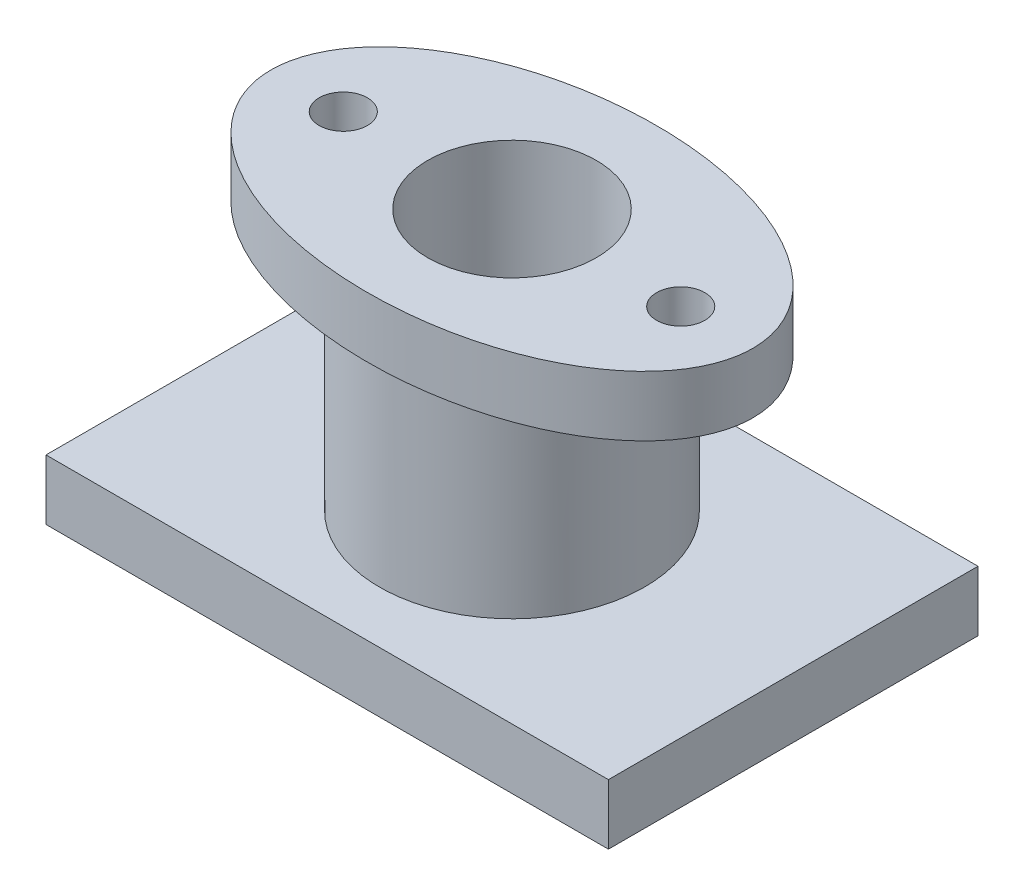
ISO-10303-21;
HEADER;
FILE_DESCRIPTION(('STEP AP214'),'2;1');
FILE_NAME('part.step','',(''),(''),'','','');
FILE_SCHEMA(('AUTOMOTIVE_DESIGN { 1 0 10303 214 1 1 1 1 }'));
ENDSEC;
DATA;
#1=APPLICATION_CONTEXT('core data for automotive mechanical design processes');
#2=APPLICATION_PROTOCOL_DEFINITION('international standard','automotive_design',2000,#1);
#3=PRODUCT_CONTEXT('',#1,'mechanical');
#4=PRODUCT('Part','Part','',(#3));
#5=PRODUCT_RELATED_PRODUCT_CATEGORY('part','',(#4));
#6=PRODUCT_DEFINITION_FORMATION('','',#4);
#7=PRODUCT_DEFINITION_CONTEXT('part definition',#1,'design');
#8=PRODUCT_DEFINITION('design','',#6,#7);
#9=PRODUCT_DEFINITION_SHAPE('','',#8);
#10=(LENGTH_UNIT() NAMED_UNIT(*) SI_UNIT(.MILLI.,.METRE.));
#11=(NAMED_UNIT(*) PLANE_ANGLE_UNIT() SI_UNIT($,.RADIAN.));
#12=(NAMED_UNIT(*) SI_UNIT($,.STERADIAN.) SOLID_ANGLE_UNIT());
#13=UNCERTAINTY_MEASURE_WITH_UNIT(LENGTH_MEASURE(1.E-05),#10,'distance_accuracy_value','');
#14=(GEOMETRIC_REPRESENTATION_CONTEXT(3) GLOBAL_UNCERTAINTY_ASSIGNED_CONTEXT((#13)) GLOBAL_UNIT_ASSIGNED_CONTEXT((#10,
#11,#12)) REPRESENTATION_CONTEXT('',''));
#15=CARTESIAN_POINT('',(0.,0.,0.));
#16=DIRECTION('',(0.,0.,1.));
#17=DIRECTION('',(1.,0.,0.));
#18=AXIS2_PLACEMENT_3D('',#15,#16,#17);
#19=CARTESIAN_POINT('',(0.,15.,0.));
#20=DIRECTION('',(0.,-1.,0.));
#21=DIRECTION('',(0.,0.,-1.));
#22=AXIS2_PLACEMENT_3D('',#19,#20,#21);
#23=PLANE('',#22);
#24=CARTESIAN_POINT('',(0.,15.,0.));
#25=DIRECTION('',(0.,1.,0.));
#26=DIRECTION('',(0.,0.,1.));
#27=AXIS2_PLACEMENT_3D('',#24,#25,#26);
#28=CIRCLE('',#27,16.5);
#29=CARTESIAN_POINT('',(0.,15.,16.5));
#30=VERTEX_POINT('',#29);
#31=EDGE_CURVE('E103',#30,#30,#28,.T.);
#32=ORIENTED_EDGE('',*,*,#31,.F.);
#33=EDGE_LOOP('',(#32));
#34=FACE_BOUND('',#33,.T.);
#35=CARTESIAN_POINT('',(0.,15.,0.));
#36=DIRECTION('',(0.,1.,0.));
#37=DIRECTION('',(0.,0.,1.));
#38=AXIS2_PLACEMENT_3D('',#35,#36,#37);
#39=CIRCLE('',#38,21.);
#40=CARTESIAN_POINT('',(0.,15.,21.));
#41=VERTEX_POINT('',#40);
#42=EDGE_CURVE('E124',#41,#41,#39,.T.);
#43=ORIENTED_EDGE('',*,*,#42,.T.);
#44=EDGE_LOOP('',(#43));
#45=FACE_BOUND('',#44,.T.);
#46=ADVANCED_FACE('F33',(#34,#45),#23,.F.);
#47=CARTESIAN_POINT('',(0.,15.,0.));
#48=DIRECTION('',(0.,-1.,0.));
#49=DIRECTION('',(0.,0.,-1.));
#50=AXIS2_PLACEMENT_3D('',#47,#48,#49);
#51=CIRCLE('',#50,33.);
#52=CARTESIAN_POINT('',(0.,15.,-33.));
#53=VERTEX_POINT('',#52);
#54=EDGE_CURVE('E11',#53,#53,#51,.F.);
#55=ORIENTED_EDGE('',*,*,#54,.F.);
#56=EDGE_LOOP('',(#55));
#57=FACE_BOUND('',#56,.T.);
#58=DIRECTION('',(0.,0.,-1.));
#59=VECTOR('',#58,1.);
#60=CARTESIAN_POINT('',(70.,15.,46.));
#61=LINE('',#60,#59);
#62=CARTESIAN_POINT('',(70.,15.,46.));
#63=VERTEX_POINT('',#62);
#64=CARTESIAN_POINT('',(70.,15.,-46.));
#65=VERTEX_POINT('',#64);
#66=EDGE_CURVE('E86',#63,#65,#61,.T.);
#67=ORIENTED_EDGE('',*,*,#66,.T.);
#68=DIRECTION('',(-1.,0.,0.));
#69=VECTOR('',#68,1.);
#70=CARTESIAN_POINT('',(-70.,15.,-46.));
#71=LINE('',#70,#69);
#72=CARTESIAN_POINT('',(-70.,15.,-46.));
#73=VERTEX_POINT('',#72);
#74=EDGE_CURVE('E81',#65,#73,#71,.T.);
#75=ORIENTED_EDGE('',*,*,#74,.T.);
#76=DIRECTION('',(0.,0.,1.));
#77=VECTOR('',#76,1.);
#78=CARTESIAN_POINT('',(-70.,15.,46.));
#79=LINE('',#78,#77);
#80=CARTESIAN_POINT('',(-70.,15.,46.));
#81=VERTEX_POINT('',#80);
#82=EDGE_CURVE('E84',#73,#81,#79,.T.);
#83=ORIENTED_EDGE('',*,*,#82,.T.);
#84=DIRECTION('',(1.,0.,0.));
#85=VECTOR('',#84,1.);
#86=CARTESIAN_POINT('',(-70.,15.,46.));
#87=LINE('',#86,#85);
#88=EDGE_CURVE('E50',#81,#63,#87,.T.);
#89=ORIENTED_EDGE('',*,*,#88,.T.);
#90=EDGE_LOOP('',(#67,#75,#83,#89));
#91=FACE_BOUND('',#90,.T.);
#92=ADVANCED_FACE('F82',(#57,#91),#23,.F.);
#93=CARTESIAN_POINT('',(0.,0.,0.));
#94=DIRECTION('',(0.,-1.,0.));
#95=DIRECTION('',(0.,0.,-1.));
#96=AXIS2_PLACEMENT_3D('',#93,#94,#95);
#97=PLANE('',#96);
#98=DIRECTION('',(0.,0.,-1.));
#99=VECTOR('',#98,1.);
#100=CARTESIAN_POINT('',(70.,0.,46.));
#101=LINE('',#100,#99);
#102=CARTESIAN_POINT('',(70.,0.,46.));
#103=VERTEX_POINT('',#102);
#104=CARTESIAN_POINT('',(70.,0.,-46.));
#105=VERTEX_POINT('',#104);
#106=EDGE_CURVE('E100',#103,#105,#101,.T.);
#107=ORIENTED_EDGE('',*,*,#106,.F.);
#108=DIRECTION('',(1.,0.,0.));
#109=VECTOR('',#108,1.);
#110=CARTESIAN_POINT('',(-70.,0.,46.));
#111=LINE('',#110,#109);
#112=CARTESIAN_POINT('',(-70.,0.,46.));
#113=VERTEX_POINT('',#112);
#114=EDGE_CURVE('E73',#113,#103,#111,.T.);
#115=ORIENTED_EDGE('',*,*,#114,.F.);
#116=DIRECTION('',(0.,0.,1.));
#117=VECTOR('',#116,1.);
#118=CARTESIAN_POINT('',(-70.,0.,46.));
#119=LINE('',#118,#117);
#120=CARTESIAN_POINT('',(-70.,0.,-46.));
#121=VERTEX_POINT('',#120);
#122=EDGE_CURVE('E67',#121,#113,#119,.T.);
#123=ORIENTED_EDGE('',*,*,#122,.F.);
#124=DIRECTION('',(-1.,0.,0.));
#125=VECTOR('',#124,1.);
#126=CARTESIAN_POINT('',(-70.,0.,-46.));
#127=LINE('',#126,#125);
#128=EDGE_CURVE('E91',#105,#121,#127,.T.);
#129=ORIENTED_EDGE('',*,*,#128,.F.);
#130=EDGE_LOOP('',(#107,#115,#123,#129));
#131=FACE_BOUND('',#130,.T.);
#132=CARTESIAN_POINT('',(0.,0.,0.));
#133=DIRECTION('',(0.,1.,0.));
#134=DIRECTION('',(0.,0.,1.));
#135=AXIS2_PLACEMENT_3D('',#132,#133,#134);
#136=CIRCLE('',#135,16.5);
#137=CARTESIAN_POINT('',(0.,0.,16.5));
#138=VERTEX_POINT('',#137);
#139=EDGE_CURVE('E117',#138,#138,#136,.T.);
#140=ORIENTED_EDGE('',*,*,#139,.T.);
#141=EDGE_LOOP('',(#140));
#142=FACE_BOUND('',#141,.T.);
#143=ADVANCED_FACE('F111',(#131,#142),#97,.T.);
#144=CARTESIAN_POINT('',(70.,15.,46.));
#145=DIRECTION('',(-1.,0.,0.));
#146=DIRECTION('',(0.,0.,1.));
#147=AXIS2_PLACEMENT_3D('',#144,#145,#146);
#148=PLANE('',#147);
#149=ORIENTED_EDGE('',*,*,#106,.T.);
#150=DIRECTION('',(0.,-1.,0.));
#151=VECTOR('',#150,1.);
#152=CARTESIAN_POINT('',(70.,15.,-46.));
#153=LINE('',#152,#151);
#154=EDGE_CURVE('E42',#65,#105,#153,.T.);
#155=ORIENTED_EDGE('',*,*,#154,.F.);
#156=ORIENTED_EDGE('',*,*,#66,.F.);
#157=DIRECTION('',(0.,-1.,0.));
#158=VECTOR('',#157,1.);
#159=CARTESIAN_POINT('',(70.,15.,46.));
#160=LINE('',#159,#158);
#161=EDGE_CURVE('E96',#63,#103,#160,.T.);
#162=ORIENTED_EDGE('',*,*,#161,.T.);
#163=EDGE_LOOP('',(#149,#155,#156,#162));
#164=FACE_BOUND('',#163,.T.);
#165=ADVANCED_FACE('F35',(#164),#148,.F.);
#166=CARTESIAN_POINT('',(-70.,15.,-46.));
#167=DIRECTION('',(0.,0.,1.));
#168=DIRECTION('',(1.,0.,0.));
#169=AXIS2_PLACEMENT_3D('',#166,#167,#168);
#170=PLANE('',#169);
#171=ORIENTED_EDGE('',*,*,#128,.T.);
#172=DIRECTION('',(0.,-1.,0.));
#173=VECTOR('',#172,1.);
#174=CARTESIAN_POINT('',(-70.,15.,-46.));
#175=LINE('',#174,#173);
#176=EDGE_CURVE('E89',#73,#121,#175,.T.);
#177=ORIENTED_EDGE('',*,*,#176,.F.);
#178=ORIENTED_EDGE('',*,*,#74,.F.);
#179=ORIENTED_EDGE('',*,*,#154,.T.);
#180=EDGE_LOOP('',(#171,#177,#178,#179));
#181=FACE_BOUND('',#180,.T.);
#182=ADVANCED_FACE('F90',(#181),#170,.F.);
#183=CARTESIAN_POINT('',(-70.,15.,46.));
#184=DIRECTION('',(1.,0.,0.));
#185=DIRECTION('',(0.,0.,-1.));
#186=AXIS2_PLACEMENT_3D('',#183,#184,#185);
#187=PLANE('',#186);
#188=ORIENTED_EDGE('',*,*,#122,.T.);
#189=DIRECTION('',(0.,-1.,0.));
#190=VECTOR('',#189,1.);
#191=CARTESIAN_POINT('',(-70.,15.,46.));
#192=LINE('',#191,#190);
#193=EDGE_CURVE('E92',#81,#113,#192,.T.);
#194=ORIENTED_EDGE('',*,*,#193,.F.);
#195=ORIENTED_EDGE('',*,*,#82,.F.);
#196=ORIENTED_EDGE('',*,*,#176,.T.);
#197=EDGE_LOOP('',(#188,#194,#195,#196));
#198=FACE_BOUND('',#197,.T.);
#199=ADVANCED_FACE('F94',(#198),#187,.F.);
#200=CARTESIAN_POINT('',(-70.,15.,46.));
#201=DIRECTION('',(0.,0.,-1.));
#202=DIRECTION('',(-1.,0.,0.));
#203=AXIS2_PLACEMENT_3D('',#200,#201,#202);
#204=PLANE('',#203);
#205=ORIENTED_EDGE('',*,*,#114,.T.);
#206=ORIENTED_EDGE('',*,*,#161,.F.);
#207=ORIENTED_EDGE('',*,*,#88,.F.);
#208=ORIENTED_EDGE('',*,*,#193,.T.);
#209=EDGE_LOOP('',(#205,#206,#207,#208));
#210=FACE_BOUND('',#209,.T.);
#211=ADVANCED_FACE('F160',(#210),#204,.F.);
#212=CARTESIAN_POINT('',(0.,15.,0.));
#213=DIRECTION('',(0.,-1.,0.));
#214=DIRECTION('',(0.,0.,-1.));
#215=AXIS2_PLACEMENT_3D('',#212,#213,#214);
#216=CYLINDRICAL_SURFACE('',#215,16.5);
#217=ORIENTED_EDGE('',*,*,#31,.T.);
#218=EDGE_LOOP('',(#217));
#219=FACE_BOUND('',#218,.T.);
#220=ORIENTED_EDGE('',*,*,#139,.F.);
#221=EDGE_LOOP('',(#220));
#222=FACE_BOUND('',#221,.T.);
#223=ADVANCED_FACE('F156',(#219,#222),#216,.F.);
#224=CARTESIAN_POINT('',(0.,65.,0.));
#225=DIRECTION('',(0.,-1.,0.));
#226=DIRECTION('',(0.,0.,-1.));
#227=AXIS2_PLACEMENT_3D('',#224,#225,#226);
#228=CYLINDRICAL_SURFACE('',#227,33.);
#229=CARTESIAN_POINT('',(0.,65.,0.));
#230=DIRECTION('',(0.,1.,0.));
#231=DIRECTION('',(0.,0.,1.));
#232=AXIS2_PLACEMENT_3D('',#229,#230,#231);
#233=CIRCLE('',#232,33.);
#234=CARTESIAN_POINT('',(0.,65.,33.));
#235=VERTEX_POINT('',#234);
#236=EDGE_CURVE('E119',#235,#235,#233,.T.);
#237=ORIENTED_EDGE('',*,*,#236,.F.);
#238=EDGE_LOOP('',(#237));
#239=FACE_BOUND('',#238,.T.);
#240=ORIENTED_EDGE('',*,*,#54,.T.);
#241=EDGE_LOOP('',(#240));
#242=FACE_BOUND('',#241,.T.);
#243=ADVANCED_FACE('F152',(#239,#242),#228,.T.);
#244=CARTESIAN_POINT('',(0.,65.,0.));
#245=DIRECTION('',(0.,-1.,0.));
#246=DIRECTION('',(0.,0.,-1.));
#247=AXIS2_PLACEMENT_3D('',#244,#245,#246);
#248=CYLINDRICAL_SURFACE('',#247,21.);
#249=ORIENTED_EDGE('',*,*,#42,.F.);
#250=EDGE_LOOP('',(#249));
#251=FACE_BOUND('',#250,.T.);
#252=CARTESIAN_POINT('',(0.,80.,0.));
#253=DIRECTION('',(0.,1.,0.));
#254=DIRECTION('',(0.,0.,1.));
#255=AXIS2_PLACEMENT_3D('',#252,#253,#254);
#256=CIRCLE('',#255,21.);
#257=CARTESIAN_POINT('',(0.,80.,21.));
#258=VERTEX_POINT('',#257);
#259=EDGE_CURVE('E182',#258,#258,#256,.T.);
#260=ORIENTED_EDGE('',*,*,#259,.T.);
#261=EDGE_LOOP('',(#260));
#262=FACE_BOUND('',#261,.T.);
#263=ADVANCED_FACE('F148',(#251,#262),#248,.F.);
#264=CARTESIAN_POINT('',(0.,80.,0.));
#265=DIRECTION('',(0.,1.,0.));
#266=DIRECTION('',(0.,0.,1.));
#267=AXIS2_PLACEMENT_3D('',#264,#265,#266);
#268=PLANE('',#267);
#269=CARTESIAN_POINT('',(42.,80.,0.));
#270=DIRECTION('',(0.,1.,0.));
#271=DIRECTION('',(0.,0.,-1.));
#272=AXIS2_PLACEMENT_3D('',#269,#270,#271);
#273=CIRCLE('',#272,5.99999999999999);
#274=CARTESIAN_POINT('',(42.,80.,-5.99999999999999));
#275=VERTEX_POINT('',#274);
#276=EDGE_CURVE('E187',#275,#275,#273,.T.);
#277=ORIENTED_EDGE('',*,*,#276,.F.);
#278=EDGE_LOOP('',(#277));
#279=FACE_BOUND('',#278,.T.);
#280=CARTESIAN_POINT('',(0.,80.,0.));
#281=DIRECTION('',(0.,1.,0.));
#282=DIRECTION('',(1.,0.,0.));
#283=AXIS2_PLACEMENT_3D('',#280,#281,#282);
#284=ELLIPSE('',#283,60.,36.);
#285=CARTESIAN_POINT('',(60.,80.,0.));
#286=VERTEX_POINT('',#285);
#287=EDGE_CURVE('E129',#286,#286,#284,.T.);
#288=ORIENTED_EDGE('',*,*,#287,.T.);
#289=EDGE_LOOP('',(#288));
#290=FACE_BOUND('',#289,.T.);
#291=CARTESIAN_POINT('',(-42.,80.,0.));
#292=DIRECTION('',(0.,1.,0.));
#293=DIRECTION('',(0.,0.,1.));
#294=AXIS2_PLACEMENT_3D('',#291,#292,#293);
#295=CIRCLE('',#294,5.99999999999999);
#296=CARTESIAN_POINT('',(-42.,80.,5.99999999999999));
#297=VERTEX_POINT('',#296);
#298=EDGE_CURVE('E133',#297,#297,#295,.T.);
#299=ORIENTED_EDGE('',*,*,#298,.F.);
#300=EDGE_LOOP('',(#299));
#301=FACE_BOUND('',#300,.T.);
#302=ORIENTED_EDGE('',*,*,#259,.F.);
#303=EDGE_LOOP('',(#302));
#304=FACE_BOUND('',#303,.T.);
#305=ADVANCED_FACE('F151',(#279,#290,#301,#304),#268,.T.);
#306=CARTESIAN_POINT('',(0.,65.,0.));
#307=DIRECTION('',(0.,1.,0.));
#308=DIRECTION('',(0.,0.,1.));
#309=AXIS2_PLACEMENT_3D('',#306,#307,#308);
#310=PLANE('',#309);
#311=ORIENTED_EDGE('',*,*,#236,.T.);
#312=EDGE_LOOP('',(#311));
#313=FACE_BOUND('',#312,.T.);
#314=CARTESIAN_POINT('',(0.,65.,0.));
#315=DIRECTION('',(0.,1.,0.));
#316=DIRECTION('',(1.,0.,0.));
#317=AXIS2_PLACEMENT_3D('',#314,#315,#316);
#318=ELLIPSE('',#317,60.,36.);
#319=CARTESIAN_POINT('',(60.,65.,0.));
#320=VERTEX_POINT('',#319);
#321=EDGE_CURVE('E130',#320,#320,#318,.T.);
#322=ORIENTED_EDGE('',*,*,#321,.F.);
#323=EDGE_LOOP('',(#322));
#324=FACE_BOUND('',#323,.T.);
#325=CARTESIAN_POINT('',(-42.,65.,0.));
#326=DIRECTION('',(0.,1.,0.));
#327=DIRECTION('',(0.,0.,1.));
#328=AXIS2_PLACEMENT_3D('',#325,#326,#327);
#329=CIRCLE('',#328,5.99999999999999);
#330=CARTESIAN_POINT('',(-42.,65.,5.99999999999999));
#331=VERTEX_POINT('',#330);
#332=EDGE_CURVE('E137',#331,#331,#329,.T.);
#333=ORIENTED_EDGE('',*,*,#332,.T.);
#334=EDGE_LOOP('',(#333));
#335=FACE_BOUND('',#334,.T.);
#336=CARTESIAN_POINT('',(42.,65.,0.));
#337=DIRECTION('',(0.,1.,0.));
#338=DIRECTION('',(0.,0.,-1.));
#339=AXIS2_PLACEMENT_3D('',#336,#337,#338);
#340=CIRCLE('',#339,5.99999999999999);
#341=CARTESIAN_POINT('',(42.,65.,-5.99999999999999));
#342=VERTEX_POINT('',#341);
#343=EDGE_CURVE('E184',#342,#342,#340,.T.);
#344=ORIENTED_EDGE('',*,*,#343,.T.);
#345=EDGE_LOOP('',(#344));
#346=FACE_BOUND('',#345,.T.);
#347=ADVANCED_FACE('F145',(#313,#324,#335,#346),#310,.F.);
#348=DIRECTION('',(0.,-1.,0.));
#349=VECTOR('',#348,1.);
#350=SURFACE_OF_LINEAR_EXTRUSION('',#284,#349);
#351=ORIENTED_EDGE('',*,*,#287,.F.);
#352=EDGE_LOOP('',(#351));
#353=FACE_BOUND('',#352,.T.);
#354=ORIENTED_EDGE('',*,*,#321,.T.);
#355=EDGE_LOOP('',(#354));
#356=FACE_BOUND('',#355,.T.);
#357=ADVANCED_FACE('F140',(#353,#356),#350,.F.);
#358=CARTESIAN_POINT('',(-42.,80.,0.));
#359=DIRECTION('',(0.,-1.,0.));
#360=DIRECTION('',(0.,0.,-1.));
#361=AXIS2_PLACEMENT_3D('',#358,#359,#360);
#362=CYLINDRICAL_SURFACE('',#361,5.99999999999999);
#363=ORIENTED_EDGE('',*,*,#298,.T.);
#364=EDGE_LOOP('',(#363));
#365=FACE_BOUND('',#364,.T.);
#366=ORIENTED_EDGE('',*,*,#332,.F.);
#367=EDGE_LOOP('',(#366));
#368=FACE_BOUND('',#367,.T.);
#369=ADVANCED_FACE('F144',(#365,#368),#362,.F.);
#370=CARTESIAN_POINT('',(42.,80.,0.));
#371=DIRECTION('',(0.,-1.,0.));
#372=DIRECTION('',(0.,0.,-1.));
#373=AXIS2_PLACEMENT_3D('',#370,#371,#372);
#374=CYLINDRICAL_SURFACE('',#373,5.99999999999999);
#375=ORIENTED_EDGE('',*,*,#276,.T.);
#376=EDGE_LOOP('',(#375));
#377=FACE_BOUND('',#376,.T.);
#378=ORIENTED_EDGE('',*,*,#343,.F.);
#379=EDGE_LOOP('',(#378));
#380=FACE_BOUND('',#379,.T.);
#381=ADVANCED_FACE('F200',(#377,#380),#374,.F.);
#382=CLOSED_SHELL('',(#46,#92,#143,#165,#182,#199,#211,#223,#243,#263,#305,#347,#357,#369,#381));
#383=MANIFOLD_SOLID_BREP('B2',#382);
#384=ADVANCED_BREP_SHAPE_REPRESENTATION('',(#18,#383),#14);
#385=SHAPE_DEFINITION_REPRESENTATION(#9,#384);
ENDSEC;
END-ISO-10303-21;
